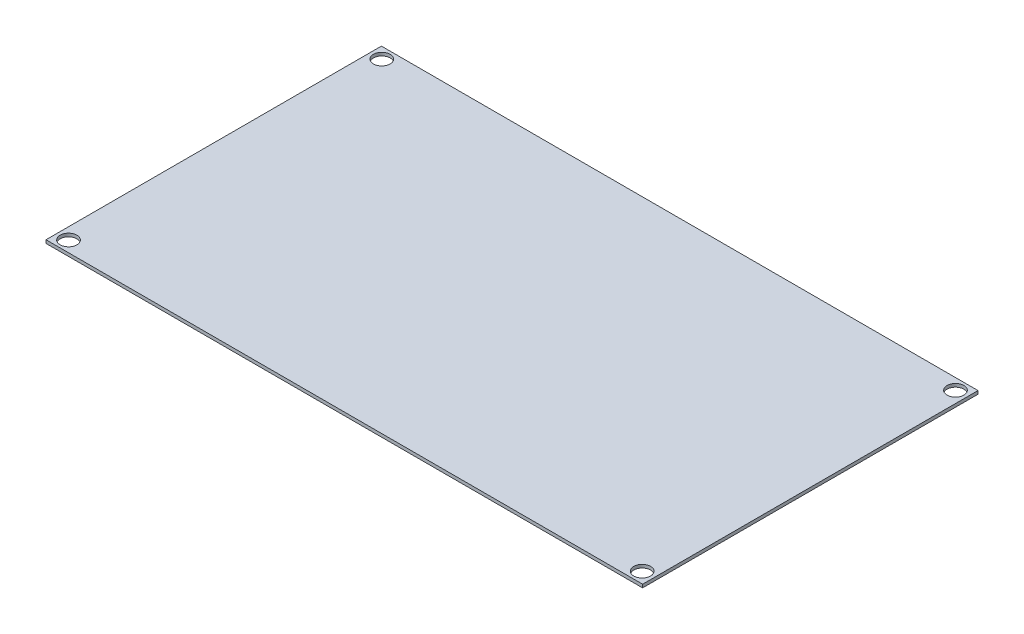
ISO-10303-21;
HEADER;
FILE_DESCRIPTION(('STEP AP214'),'2;1');
FILE_NAME('part.step','',(''),(''),'','','');
FILE_SCHEMA(('AUTOMOTIVE_DESIGN { 1 0 10303 214 1 1 1 1 }'));
ENDSEC;
DATA;
#1=APPLICATION_CONTEXT('core data for automotive mechanical design processes');
#2=APPLICATION_PROTOCOL_DEFINITION('international standard','automotive_design',2000,#1);
#3=PRODUCT_CONTEXT('',#1,'mechanical');
#4=PRODUCT('Part','Part','',(#3));
#5=PRODUCT_RELATED_PRODUCT_CATEGORY('part','',(#4));
#6=PRODUCT_DEFINITION_FORMATION('','',#4);
#7=PRODUCT_DEFINITION_CONTEXT('part definition',#1,'design');
#8=PRODUCT_DEFINITION('design','',#6,#7);
#9=PRODUCT_DEFINITION_SHAPE('','',#8);
#10=(LENGTH_UNIT() NAMED_UNIT(*) SI_UNIT(.MILLI.,.METRE.));
#11=(NAMED_UNIT(*) PLANE_ANGLE_UNIT() SI_UNIT($,.RADIAN.));
#12=(NAMED_UNIT(*) SI_UNIT($,.STERADIAN.) SOLID_ANGLE_UNIT());
#13=UNCERTAINTY_MEASURE_WITH_UNIT(LENGTH_MEASURE(1.E-05),#10,'distance_accuracy_value','');
#14=(GEOMETRIC_REPRESENTATION_CONTEXT(3) GLOBAL_UNCERTAINTY_ASSIGNED_CONTEXT((#13)) GLOBAL_UNIT_ASSIGNED_CONTEXT((#10,
#11,#12)) REPRESENTATION_CONTEXT('',''));
#15=CARTESIAN_POINT('',(0.,0.,0.));
#16=DIRECTION('',(0.,0.,1.));
#17=DIRECTION('',(1.,0.,0.));
#18=AXIS2_PLACEMENT_3D('',#15,#16,#17);
#19=CARTESIAN_POINT('',(0.,1.,0.));
#20=DIRECTION('',(0.,1.,0.));
#21=DIRECTION('',(0.,0.,1.));
#22=AXIS2_PLACEMENT_3D('',#19,#20,#21);
#23=PLANE('',#22);
#24=CARTESIAN_POINT('',(88.94,1.,48.575));
#25=DIRECTION('',(0.,1.,0.));
#26=DIRECTION('',(0.,0.,1.));
#27=AXIS2_PLACEMENT_3D('',#24,#25,#26);
#28=CIRCLE('',#27,2.6);
#29=CARTESIAN_POINT('',(88.94,1.,51.175));
#30=VERTEX_POINT('',#29);
#31=EDGE_CURVE('E123',#30,#30,#28,.T.);
#32=ORIENTED_EDGE('',*,*,#31,.F.);
#33=EDGE_LOOP('',(#32));
#34=FACE_BOUND('',#33,.T.);
#35=CARTESIAN_POINT('',(-88.94,1.,-48.575));
#36=DIRECTION('',(0.,1.,0.));
#37=DIRECTION('',(0.,0.,1.));
#38=AXIS2_PLACEMENT_3D('',#35,#36,#37);
#39=CIRCLE('',#38,2.6);
#40=CARTESIAN_POINT('',(-88.94,1.,-45.975));
#41=VERTEX_POINT('',#40);
#42=EDGE_CURVE('E102',#41,#41,#39,.T.);
#43=ORIENTED_EDGE('',*,*,#42,.F.);
#44=EDGE_LOOP('',(#43));
#45=FACE_BOUND('',#44,.T.);
#46=DIRECTION('',(0.,0.,-1.));
#47=VECTOR('',#46,1.);
#48=CARTESIAN_POINT('',(92.5,1.,-52.));
#49=LINE('',#48,#47);
#50=CARTESIAN_POINT('',(92.5,1.,52.));
#51=VERTEX_POINT('',#50);
#52=CARTESIAN_POINT('',(92.5,1.,-52.));
#53=VERTEX_POINT('',#52);
#54=EDGE_CURVE('E87',#51,#53,#49,.T.);
#55=ORIENTED_EDGE('',*,*,#54,.T.);
#56=DIRECTION('',(-1.,0.,0.));
#57=VECTOR('',#56,1.);
#58=CARTESIAN_POINT('',(-92.5,1.,-52.));
#59=LINE('',#58,#57);
#60=CARTESIAN_POINT('',(-92.5,1.,-52.));
#61=VERTEX_POINT('',#60);
#62=EDGE_CURVE('E82',#53,#61,#59,.T.);
#63=ORIENTED_EDGE('',*,*,#62,.T.);
#64=DIRECTION('',(0.,0.,1.));
#65=VECTOR('',#64,1.);
#66=CARTESIAN_POINT('',(-92.5,1.,-52.));
#67=LINE('',#66,#65);
#68=CARTESIAN_POINT('',(-92.5,1.,52.));
#69=VERTEX_POINT('',#68);
#70=EDGE_CURVE('E85',#61,#69,#67,.T.);
#71=ORIENTED_EDGE('',*,*,#70,.T.);
#72=DIRECTION('',(1.,0.,0.));
#73=VECTOR('',#72,1.);
#74=CARTESIAN_POINT('',(-92.5,1.,52.));
#75=LINE('',#74,#73);
#76=EDGE_CURVE('E52',#69,#51,#75,.T.);
#77=ORIENTED_EDGE('',*,*,#76,.T.);
#78=EDGE_LOOP('',(#55,#63,#71,#77));
#79=FACE_BOUND('',#78,.T.);
#80=CARTESIAN_POINT('',(88.94,1.,-48.575));
#81=DIRECTION('',(0.,1.,0.));
#82=DIRECTION('',(0.,0.,-1.));
#83=AXIS2_PLACEMENT_3D('',#80,#81,#82);
#84=CIRCLE('',#83,2.6);
#85=CARTESIAN_POINT('',(88.94,1.,-51.1750000000001));
#86=VERTEX_POINT('',#85);
#87=EDGE_CURVE('E117',#86,#86,#84,.T.);
#88=ORIENTED_EDGE('',*,*,#87,.F.);
#89=EDGE_LOOP('',(#88));
#90=FACE_BOUND('',#89,.T.);
#91=CARTESIAN_POINT('',(-88.94,1.,48.575));
#92=DIRECTION('',(0.,1.,0.));
#93=DIRECTION('',(0.,0.,-1.));
#94=AXIS2_PLACEMENT_3D('',#91,#92,#93);
#95=CIRCLE('',#94,2.6);
#96=CARTESIAN_POINT('',(-88.94,1.,45.975));
#97=VERTEX_POINT('',#96);
#98=EDGE_CURVE('E129',#97,#97,#95,.T.);
#99=ORIENTED_EDGE('',*,*,#98,.F.);
#100=EDGE_LOOP('',(#99));
#101=FACE_BOUND('',#100,.T.);
#102=ADVANCED_FACE('F35',(#34,#45,#79,#90,#101),#23,.T.);
#103=CARTESIAN_POINT('',(0.,0.,0.));
#104=DIRECTION('',(0.,1.,0.));
#105=DIRECTION('',(0.,0.,1.));
#106=AXIS2_PLACEMENT_3D('',#103,#104,#105);
#107=PLANE('',#106);
#108=DIRECTION('',(0.,0.,-1.));
#109=VECTOR('',#108,1.);
#110=CARTESIAN_POINT('',(92.5,0.,-52.));
#111=LINE('',#110,#109);
#112=CARTESIAN_POINT('',(92.5,0.,52.));
#113=VERTEX_POINT('',#112);
#114=CARTESIAN_POINT('',(92.5,0.,-52.));
#115=VERTEX_POINT('',#114);
#116=EDGE_CURVE('E99',#113,#115,#111,.T.);
#117=ORIENTED_EDGE('',*,*,#116,.F.);
#118=DIRECTION('',(1.,0.,0.));
#119=VECTOR('',#118,1.);
#120=CARTESIAN_POINT('',(-92.5,0.,52.));
#121=LINE('',#120,#119);
#122=CARTESIAN_POINT('',(-92.5,0.,52.));
#123=VERTEX_POINT('',#122);
#124=EDGE_CURVE('E75',#123,#113,#121,.T.);
#125=ORIENTED_EDGE('',*,*,#124,.F.);
#126=DIRECTION('',(0.,0.,1.));
#127=VECTOR('',#126,1.);
#128=CARTESIAN_POINT('',(-92.5,0.,-52.));
#129=LINE('',#128,#127);
#130=CARTESIAN_POINT('',(-92.5,0.,-52.));
#131=VERTEX_POINT('',#130);
#132=EDGE_CURVE('E69',#131,#123,#129,.T.);
#133=ORIENTED_EDGE('',*,*,#132,.F.);
#134=DIRECTION('',(-1.,0.,0.));
#135=VECTOR('',#134,1.);
#136=CARTESIAN_POINT('',(-92.5,0.,-52.));
#137=LINE('',#136,#135);
#138=EDGE_CURVE('E91',#115,#131,#137,.T.);
#139=ORIENTED_EDGE('',*,*,#138,.F.);
#140=EDGE_LOOP('',(#117,#125,#133,#139));
#141=FACE_BOUND('',#140,.T.);
#142=CARTESIAN_POINT('',(-88.94,0.,-48.575));
#143=DIRECTION('',(0.,1.,0.));
#144=DIRECTION('',(0.,0.,1.));
#145=AXIS2_PLACEMENT_3D('',#142,#143,#144);
#146=CIRCLE('',#145,2.6);
#147=CARTESIAN_POINT('',(-88.94,0.,-45.975));
#148=VERTEX_POINT('',#147);
#149=EDGE_CURVE('E114',#148,#148,#146,.T.);
#150=ORIENTED_EDGE('',*,*,#149,.T.);
#151=EDGE_LOOP('',(#150));
#152=FACE_BOUND('',#151,.T.);
#153=CARTESIAN_POINT('',(88.94,0.,-48.575));
#154=DIRECTION('',(0.,1.,0.));
#155=DIRECTION('',(0.,0.,-1.));
#156=AXIS2_PLACEMENT_3D('',#153,#154,#155);
#157=CIRCLE('',#156,2.6);
#158=CARTESIAN_POINT('',(88.94,0.,-51.1750000000001));
#159=VERTEX_POINT('',#158);
#160=EDGE_CURVE('E120',#159,#159,#157,.T.);
#161=ORIENTED_EDGE('',*,*,#160,.T.);
#162=EDGE_LOOP('',(#161));
#163=FACE_BOUND('',#162,.T.);
#164=CARTESIAN_POINT('',(88.94,0.,48.575));
#165=DIRECTION('',(0.,1.,0.));
#166=DIRECTION('',(0.,0.,1.));
#167=AXIS2_PLACEMENT_3D('',#164,#165,#166);
#168=CIRCLE('',#167,2.6);
#169=CARTESIAN_POINT('',(88.94,0.,51.175));
#170=VERTEX_POINT('',#169);
#171=EDGE_CURVE('E126',#170,#170,#168,.T.);
#172=ORIENTED_EDGE('',*,*,#171,.T.);
#173=EDGE_LOOP('',(#172));
#174=FACE_BOUND('',#173,.T.);
#175=CARTESIAN_POINT('',(-88.94,0.,48.575));
#176=DIRECTION('',(0.,1.,0.));
#177=DIRECTION('',(0.,0.,-1.));
#178=AXIS2_PLACEMENT_3D('',#175,#176,#177);
#179=CIRCLE('',#178,2.6);
#180=CARTESIAN_POINT('',(-88.94,0.,45.975));
#181=VERTEX_POINT('',#180);
#182=EDGE_CURVE('E132',#181,#181,#179,.T.);
#183=ORIENTED_EDGE('',*,*,#182,.T.);
#184=EDGE_LOOP('',(#183));
#185=FACE_BOUND('',#184,.T.);
#186=ADVANCED_FACE('F110',(#141,#152,#163,#174,#185),#107,.F.);
#187=CARTESIAN_POINT('',(92.5,1.,-52.));
#188=DIRECTION('',(-1.,0.,0.));
#189=DIRECTION('',(0.,0.,1.));
#190=AXIS2_PLACEMENT_3D('',#187,#188,#189);
#191=PLANE('',#190);
#192=ORIENTED_EDGE('',*,*,#116,.T.);
#193=DIRECTION('',(0.,-1.,0.));
#194=VECTOR('',#193,1.);
#195=CARTESIAN_POINT('',(92.5,1.,-52.));
#196=LINE('',#195,#194);
#197=EDGE_CURVE('E11',#53,#115,#196,.T.);
#198=ORIENTED_EDGE('',*,*,#197,.F.);
#199=ORIENTED_EDGE('',*,*,#54,.F.);
#200=DIRECTION('',(0.,-1.,0.));
#201=VECTOR('',#200,1.);
#202=CARTESIAN_POINT('',(92.5,1.,52.));
#203=LINE('',#202,#201);
#204=EDGE_CURVE('E95',#51,#113,#203,.T.);
#205=ORIENTED_EDGE('',*,*,#204,.T.);
#206=EDGE_LOOP('',(#192,#198,#199,#205));
#207=FACE_BOUND('',#206,.T.);
#208=ADVANCED_FACE('F37',(#207),#191,.F.);
#209=CARTESIAN_POINT('',(-92.5,1.,-52.));
#210=DIRECTION('',(0.,0.,1.));
#211=DIRECTION('',(1.,0.,0.));
#212=AXIS2_PLACEMENT_3D('',#209,#210,#211);
#213=PLANE('',#212);
#214=ORIENTED_EDGE('',*,*,#138,.T.);
#215=DIRECTION('',(0.,-1.,0.));
#216=VECTOR('',#215,1.);
#217=CARTESIAN_POINT('',(-92.5,1.,-52.));
#218=LINE('',#217,#216);
#219=EDGE_CURVE('E44',#61,#131,#218,.T.);
#220=ORIENTED_EDGE('',*,*,#219,.F.);
#221=ORIENTED_EDGE('',*,*,#62,.F.);
#222=ORIENTED_EDGE('',*,*,#197,.T.);
#223=EDGE_LOOP('',(#214,#220,#221,#222));
#224=FACE_BOUND('',#223,.T.);
#225=ADVANCED_FACE('F90',(#224),#213,.F.);
#226=CARTESIAN_POINT('',(-92.5,1.,-52.));
#227=DIRECTION('',(1.,0.,0.));
#228=DIRECTION('',(0.,0.,-1.));
#229=AXIS2_PLACEMENT_3D('',#226,#227,#228);
#230=PLANE('',#229);
#231=ORIENTED_EDGE('',*,*,#132,.T.);
#232=DIRECTION('',(0.,-1.,0.));
#233=VECTOR('',#232,1.);
#234=CARTESIAN_POINT('',(-92.5,1.,52.));
#235=LINE('',#234,#233);
#236=EDGE_CURVE('E92',#69,#123,#235,.T.);
#237=ORIENTED_EDGE('',*,*,#236,.F.);
#238=ORIENTED_EDGE('',*,*,#70,.F.);
#239=ORIENTED_EDGE('',*,*,#219,.T.);
#240=EDGE_LOOP('',(#231,#237,#238,#239));
#241=FACE_BOUND('',#240,.T.);
#242=ADVANCED_FACE('F93',(#241),#230,.F.);
#243=CARTESIAN_POINT('',(-92.5,1.,52.));
#244=DIRECTION('',(0.,0.,-1.));
#245=DIRECTION('',(-1.,0.,0.));
#246=AXIS2_PLACEMENT_3D('',#243,#244,#245);
#247=PLANE('',#246);
#248=ORIENTED_EDGE('',*,*,#124,.T.);
#249=ORIENTED_EDGE('',*,*,#204,.F.);
#250=ORIENTED_EDGE('',*,*,#76,.F.);
#251=ORIENTED_EDGE('',*,*,#236,.T.);
#252=EDGE_LOOP('',(#248,#249,#250,#251));
#253=FACE_BOUND('',#252,.T.);
#254=ADVANCED_FACE('F107',(#253),#247,.F.);
#255=CARTESIAN_POINT('',(-88.94,1.,-48.575));
#256=DIRECTION('',(0.,-1.,0.));
#257=DIRECTION('',(0.,0.,-1.));
#258=AXIS2_PLACEMENT_3D('',#255,#256,#257);
#259=CYLINDRICAL_SURFACE('',#258,2.6);
#260=ORIENTED_EDGE('',*,*,#42,.T.);
#261=EDGE_LOOP('',(#260));
#262=FACE_BOUND('',#261,.T.);
#263=ORIENTED_EDGE('',*,*,#149,.F.);
#264=EDGE_LOOP('',(#263));
#265=FACE_BOUND('',#264,.T.);
#266=ADVANCED_FACE('F151',(#262,#265),#259,.F.);
#267=CARTESIAN_POINT('',(88.94,1.,-48.575));
#268=DIRECTION('',(0.,-1.,0.));
#269=DIRECTION('',(0.,0.,-1.));
#270=AXIS2_PLACEMENT_3D('',#267,#268,#269);
#271=CYLINDRICAL_SURFACE('',#270,2.6);
#272=ORIENTED_EDGE('',*,*,#87,.T.);
#273=EDGE_LOOP('',(#272));
#274=FACE_BOUND('',#273,.T.);
#275=ORIENTED_EDGE('',*,*,#160,.F.);
#276=EDGE_LOOP('',(#275));
#277=FACE_BOUND('',#276,.T.);
#278=ADVANCED_FACE('F197',(#274,#277),#271,.F.);
#279=CARTESIAN_POINT('',(88.94,1.,48.575));
#280=DIRECTION('',(0.,-1.,0.));
#281=DIRECTION('',(0.,0.,-1.));
#282=AXIS2_PLACEMENT_3D('',#279,#280,#281);
#283=CYLINDRICAL_SURFACE('',#282,2.6);
#284=ORIENTED_EDGE('',*,*,#31,.T.);
#285=EDGE_LOOP('',(#284));
#286=FACE_BOUND('',#285,.T.);
#287=ORIENTED_EDGE('',*,*,#171,.F.);
#288=EDGE_LOOP('',(#287));
#289=FACE_BOUND('',#288,.T.);
#290=ADVANCED_FACE('F205',(#286,#289),#283,.F.);
#291=CARTESIAN_POINT('',(-88.94,1.,48.575));
#292=DIRECTION('',(0.,-1.,0.));
#293=DIRECTION('',(0.,0.,-1.));
#294=AXIS2_PLACEMENT_3D('',#291,#292,#293);
#295=CYLINDRICAL_SURFACE('',#294,2.6);
#296=ORIENTED_EDGE('',*,*,#98,.T.);
#297=EDGE_LOOP('',(#296));
#298=FACE_BOUND('',#297,.T.);
#299=ORIENTED_EDGE('',*,*,#182,.F.);
#300=EDGE_LOOP('',(#299));
#301=FACE_BOUND('',#300,.T.);
#302=ADVANCED_FACE('F138',(#298,#301),#295,.F.);
#303=CLOSED_SHELL('',(#102,#186,#208,#225,#242,#254,#266,#278,#290,#302));
#304=MANIFOLD_SOLID_BREP('B2',#303);
#305=ADVANCED_BREP_SHAPE_REPRESENTATION('',(#18,#304),#14);
#306=SHAPE_DEFINITION_REPRESENTATION(#9,#305);
ENDSEC;
END-ISO-10303-21;
